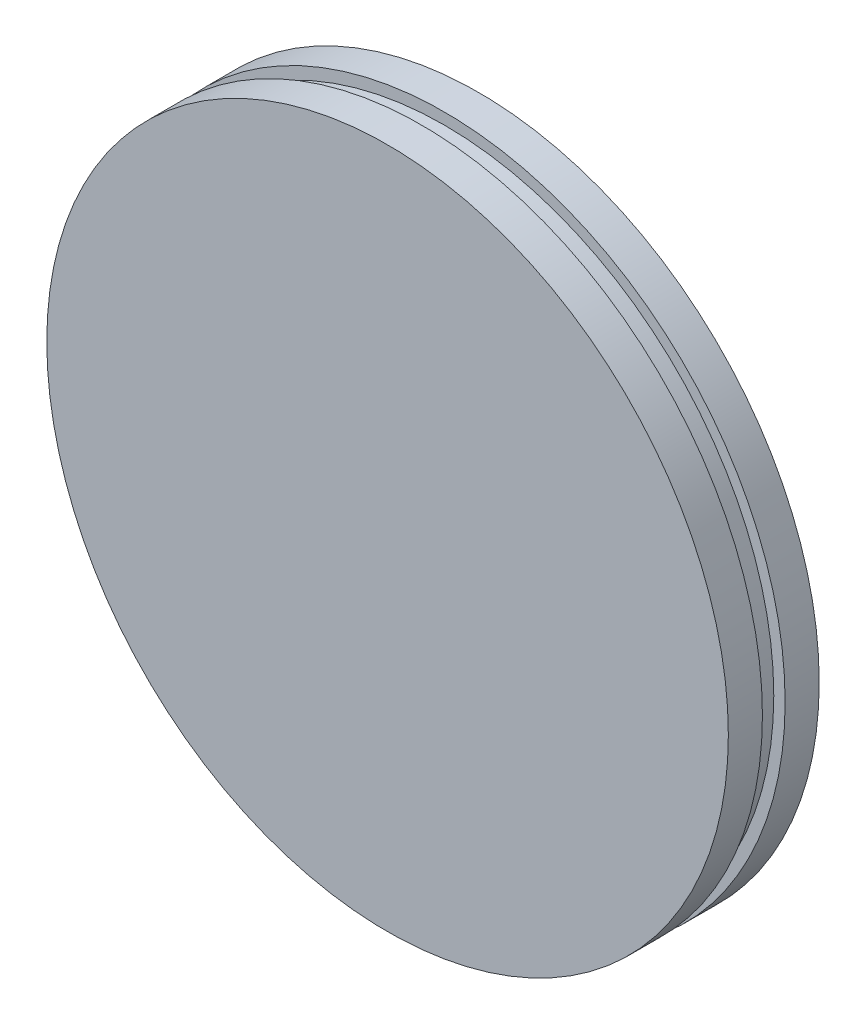
ISO-10303-21;
HEADER;
FILE_DESCRIPTION(('STEP AP214'),'2;1');
FILE_NAME('part.step','',(''),(''),'','','');
FILE_SCHEMA(('AUTOMOTIVE_DESIGN { 1 0 10303 214 1 1 1 1 }'));
ENDSEC;
DATA;
#1=APPLICATION_CONTEXT('core data for automotive mechanical design processes');
#2=APPLICATION_PROTOCOL_DEFINITION('international standard','automotive_design',2000,#1);
#3=PRODUCT_CONTEXT('',#1,'mechanical');
#4=PRODUCT('Part','Part','',(#3));
#5=PRODUCT_RELATED_PRODUCT_CATEGORY('part','',(#4));
#6=PRODUCT_DEFINITION_FORMATION('','',#4);
#7=PRODUCT_DEFINITION_CONTEXT('part definition',#1,'design');
#8=PRODUCT_DEFINITION('design','',#6,#7);
#9=PRODUCT_DEFINITION_SHAPE('','',#8);
#10=(LENGTH_UNIT() NAMED_UNIT(*) SI_UNIT(.MILLI.,.METRE.));
#11=(NAMED_UNIT(*) PLANE_ANGLE_UNIT() SI_UNIT($,.RADIAN.));
#12=(NAMED_UNIT(*) SI_UNIT($,.STERADIAN.) SOLID_ANGLE_UNIT());
#13=UNCERTAINTY_MEASURE_WITH_UNIT(LENGTH_MEASURE(1.E-05),#10,'distance_accuracy_value','');
#14=(GEOMETRIC_REPRESENTATION_CONTEXT(3) GLOBAL_UNCERTAINTY_ASSIGNED_CONTEXT((#13)) GLOBAL_UNIT_ASSIGNED_CONTEXT((#10,
#11,#12)) REPRESENTATION_CONTEXT('',''));
#15=CARTESIAN_POINT('',(0.,0.,0.));
#16=DIRECTION('',(0.,0.,1.));
#17=DIRECTION('',(1.,0.,0.));
#18=AXIS2_PLACEMENT_3D('',#15,#16,#17);
#19=CARTESIAN_POINT('',(0.,0.,6.));
#20=DIRECTION('',(0.,0.,-1.));
#21=DIRECTION('',(-1.,0.,0.));
#22=AXIS2_PLACEMENT_3D('',#19,#20,#21);
#23=CYLINDRICAL_SURFACE('',#22,30.);
#24=CARTESIAN_POINT('',(0.,0.,0.));
#25=DIRECTION('',(0.,0.,1.));
#26=DIRECTION('',(1.,0.,0.));
#27=AXIS2_PLACEMENT_3D('',#24,#25,#26);
#28=CIRCLE('',#27,30.);
#29=CARTESIAN_POINT('',(30.,0.,0.));
#30=VERTEX_POINT('',#29);
#31=EDGE_CURVE('E10',#30,#30,#28,.T.);
#32=ORIENTED_EDGE('',*,*,#31,.T.);
#33=EDGE_LOOP('',(#32));
#34=FACE_BOUND('',#33,.T.);
#35=CARTESIAN_POINT('',(0.,0.,3.));
#36=DIRECTION('',(0.,0.,1.));
#37=DIRECTION('',(1.,0.,0.));
#38=AXIS2_PLACEMENT_3D('',#35,#36,#37);
#39=CIRCLE('',#38,30.);
#40=CARTESIAN_POINT('',(30.,0.,3.));
#41=VERTEX_POINT('',#40);
#42=EDGE_CURVE('E69',#41,#41,#39,.T.);
#43=ORIENTED_EDGE('',*,*,#42,.F.);
#44=EDGE_LOOP('',(#43));
#45=FACE_BOUND('',#44,.T.);
#46=ADVANCED_FACE('F43',(#34,#45),#23,.T.);
#47=CARTESIAN_POINT('',(0.,0.,0.));
#48=DIRECTION('',(0.,0.,1.));
#49=DIRECTION('',(1.,0.,0.));
#50=AXIS2_PLACEMENT_3D('',#47,#48,#49);
#51=PLANE('',#50);
#52=ORIENTED_EDGE('',*,*,#31,.F.);
#53=EDGE_LOOP('',(#52));
#54=FACE_BOUND('',#53,.T.);
#55=CARTESIAN_POINT('',(0.,0.,0.));
#56=DIRECTION('',(0.,0.,1.));
#57=DIRECTION('',(1.,0.,0.));
#58=AXIS2_PLACEMENT_3D('',#55,#56,#57);
#59=CIRCLE('',#58,11.);
#60=CARTESIAN_POINT('',(11.,0.,0.));
#61=VERTEX_POINT('',#60);
#62=EDGE_CURVE('E50',#61,#61,#59,.T.);
#63=ORIENTED_EDGE('',*,*,#62,.T.);
#64=EDGE_LOOP('',(#63));
#65=FACE_BOUND('',#64,.T.);
#66=ADVANCED_FACE('F86',(#54,#65),#51,.F.);
#67=CARTESIAN_POINT('',(0.,0.,6.));
#68=DIRECTION('',(0.,0.,-1.));
#69=DIRECTION('',(-1.,0.,0.));
#70=AXIS2_PLACEMENT_3D('',#67,#68,#69);
#71=CYLINDRICAL_SURFACE('',#70,11.);
#72=CARTESIAN_POINT('',(0.,0.,6.));
#73=DIRECTION('',(0.,0.,1.));
#74=DIRECTION('',(1.,0.,0.));
#75=AXIS2_PLACEMENT_3D('',#72,#73,#74);
#76=CIRCLE('',#75,11.);
#77=CARTESIAN_POINT('',(11.,0.,6.));
#78=VERTEX_POINT('',#77);
#79=EDGE_CURVE('E54',#78,#78,#76,.T.);
#80=ORIENTED_EDGE('',*,*,#79,.T.);
#81=EDGE_LOOP('',(#80));
#82=FACE_BOUND('',#81,.T.);
#83=ORIENTED_EDGE('',*,*,#62,.F.);
#84=EDGE_LOOP('',(#83));
#85=FACE_BOUND('',#84,.T.);
#86=ADVANCED_FACE('F92',(#82,#85),#71,.F.);
#87=CARTESIAN_POINT('',(0.,0.,6.));
#88=DIRECTION('',(0.,0.,1.));
#89=DIRECTION('',(1.,0.,0.));
#90=AXIS2_PLACEMENT_3D('',#87,#88,#89);
#91=PLANE('',#90);
#92=ORIENTED_EDGE('',*,*,#79,.F.);
#93=EDGE_LOOP('',(#92));
#94=FACE_BOUND('',#93,.T.);
#95=ADVANCED_FACE('F106',(#94),#91,.F.);
#96=CARTESIAN_POINT('',(0.,0.,5.));
#97=DIRECTION('',(0.,0.,1.));
#98=DIRECTION('',(1.,0.,0.));
#99=AXIS2_PLACEMENT_3D('',#96,#97,#98);
#100=PLANE('',#99);
#101=CARTESIAN_POINT('',(0.,0.,5.));
#102=DIRECTION('',(0.,0.,1.));
#103=DIRECTION('',(1.,0.,0.));
#104=AXIS2_PLACEMENT_3D('',#101,#102,#103);
#105=CIRCLE('',#104,30.);
#106=CARTESIAN_POINT('',(30.,0.,5.));
#107=VERTEX_POINT('',#106);
#108=EDGE_CURVE('E63',#107,#107,#105,.T.);
#109=ORIENTED_EDGE('',*,*,#108,.F.);
#110=EDGE_LOOP('',(#109));
#111=FACE_BOUND('',#110,.T.);
#112=CARTESIAN_POINT('',(0.,0.,5.));
#113=DIRECTION('',(0.,0.,1.));
#114=DIRECTION('',(1.,0.,0.));
#115=AXIS2_PLACEMENT_3D('',#112,#113,#114);
#116=CIRCLE('',#115,29.);
#117=CARTESIAN_POINT('',(29.,0.,5.));
#118=VERTEX_POINT('',#117);
#119=EDGE_CURVE('E66',#118,#118,#116,.T.);
#120=ORIENTED_EDGE('',*,*,#119,.T.);
#121=EDGE_LOOP('',(#120));
#122=FACE_BOUND('',#121,.T.);
#123=ADVANCED_FACE('F104',(#111,#122),#100,.F.);
#124=CARTESIAN_POINT('',(0.,0.,5.));
#125=DIRECTION('',(0.,0.,-1.));
#126=DIRECTION('',(-1.,0.,0.));
#127=AXIS2_PLACEMENT_3D('',#124,#125,#126);
#128=CYLINDRICAL_SURFACE('',#127,29.);
#129=ORIENTED_EDGE('',*,*,#119,.F.);
#130=EDGE_LOOP('',(#129));
#131=FACE_BOUND('',#130,.T.);
#132=CARTESIAN_POINT('',(0.,0.,3.));
#133=DIRECTION('',(0.,0.,1.));
#134=DIRECTION('',(1.,0.,0.));
#135=AXIS2_PLACEMENT_3D('',#132,#133,#134);
#136=CIRCLE('',#135,29.);
#137=CARTESIAN_POINT('',(29.,0.,3.));
#138=VERTEX_POINT('',#137);
#139=EDGE_CURVE('E72',#138,#138,#136,.T.);
#140=ORIENTED_EDGE('',*,*,#139,.T.);
#141=EDGE_LOOP('',(#140));
#142=FACE_BOUND('',#141,.T.);
#143=ADVANCED_FACE('F76',(#131,#142),#128,.T.);
#144=CARTESIAN_POINT('',(0.,0.,3.));
#145=DIRECTION('',(0.,0.,1.));
#146=DIRECTION('',(1.,0.,0.));
#147=AXIS2_PLACEMENT_3D('',#144,#145,#146);
#148=PLANE('',#147);
#149=ORIENTED_EDGE('',*,*,#139,.F.);
#150=EDGE_LOOP('',(#149));
#151=FACE_BOUND('',#150,.T.);
#152=ORIENTED_EDGE('',*,*,#42,.T.);
#153=EDGE_LOOP('',(#152));
#154=FACE_BOUND('',#153,.T.);
#155=ADVANCED_FACE('F78',(#151,#154),#148,.T.);
#156=CARTESIAN_POINT('',(0.,0.,8.));
#157=DIRECTION('',(0.,0.,1.));
#158=DIRECTION('',(1.,0.,0.));
#159=AXIS2_PLACEMENT_3D('',#156,#157,#158);
#160=PLANE('',#159);
#161=CARTESIAN_POINT('',(0.,0.,8.));
#162=DIRECTION('',(0.,0.,1.));
#163=DIRECTION('',(1.,0.,0.));
#164=AXIS2_PLACEMENT_3D('',#161,#162,#163);
#165=CIRCLE('',#164,30.);
#166=CARTESIAN_POINT('',(30.,0.,8.));
#167=VERTEX_POINT('',#166);
#168=EDGE_CURVE('E58',#167,#167,#165,.T.);
#169=ORIENTED_EDGE('',*,*,#168,.T.);
#170=EDGE_LOOP('',(#169));
#171=FACE_BOUND('',#170,.T.);
#172=ADVANCED_FACE('F81',(#171),#160,.T.);
#173=ORIENTED_EDGE('',*,*,#108,.T.);
#174=EDGE_LOOP('',(#173));
#175=FACE_BOUND('',#174,.T.);
#176=ORIENTED_EDGE('',*,*,#168,.F.);
#177=EDGE_LOOP('',(#176));
#178=FACE_BOUND('',#177,.T.);
#179=ADVANCED_FACE('F45',(#175,#178),#23,.T.);
#180=CLOSED_SHELL('',(#46,#66,#86,#95,#123,#143,#155,#172,#179));
#181=MANIFOLD_SOLID_BREP('B2',#180);
#182=ADVANCED_BREP_SHAPE_REPRESENTATION('',(#18,#181),#14);
#183=SHAPE_DEFINITION_REPRESENTATION(#9,#182);
ENDSEC;
END-ISO-10303-21;
